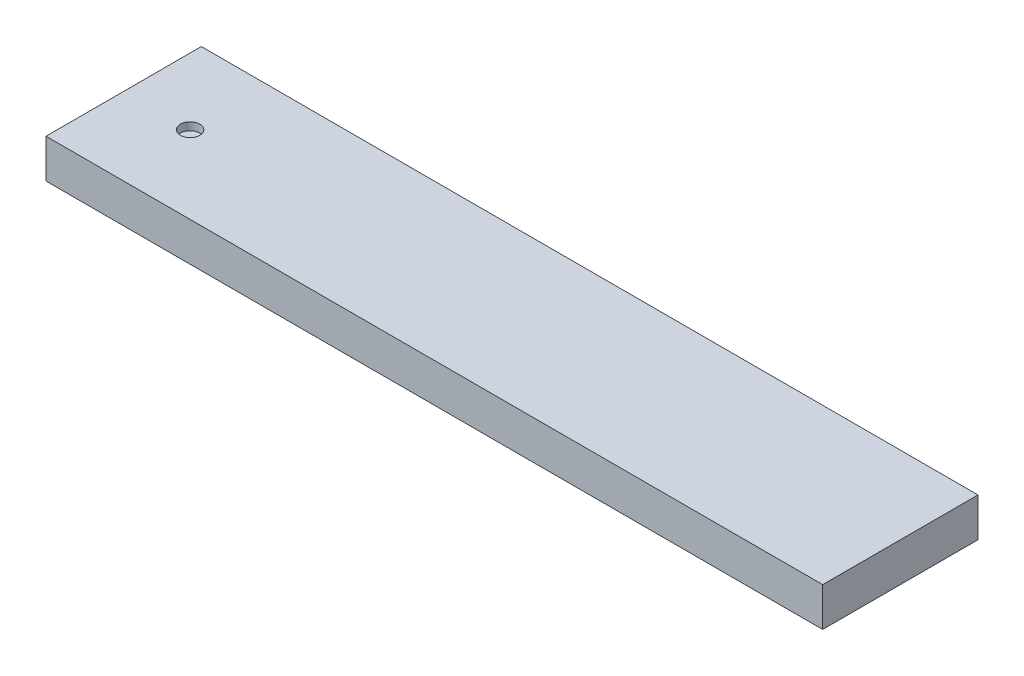
ISO-10303-21;
HEADER;
FILE_DESCRIPTION(('STEP AP214'),'2;1');
FILE_NAME('part.step','',(''),(''),'','','');
FILE_SCHEMA(('AUTOMOTIVE_DESIGN { 1 0 10303 214 1 1 1 1 }'));
ENDSEC;
DATA;
#1=APPLICATION_CONTEXT('core data for automotive mechanical design processes');
#2=APPLICATION_PROTOCOL_DEFINITION('international standard','automotive_design',2000,#1);
#3=PRODUCT_CONTEXT('',#1,'mechanical');
#4=PRODUCT('Part','Part','',(#3));
#5=PRODUCT_RELATED_PRODUCT_CATEGORY('part','',(#4));
#6=PRODUCT_DEFINITION_FORMATION('','',#4);
#7=PRODUCT_DEFINITION_CONTEXT('part definition',#1,'design');
#8=PRODUCT_DEFINITION('design','',#6,#7);
#9=PRODUCT_DEFINITION_SHAPE('','',#8);
#10=(LENGTH_UNIT() NAMED_UNIT(*) SI_UNIT(.MILLI.,.METRE.));
#11=(NAMED_UNIT(*) PLANE_ANGLE_UNIT() SI_UNIT($,.RADIAN.));
#12=(NAMED_UNIT(*) SI_UNIT($,.STERADIAN.) SOLID_ANGLE_UNIT());
#13=UNCERTAINTY_MEASURE_WITH_UNIT(LENGTH_MEASURE(1.E-05),#10,'distance_accuracy_value','');
#14=(GEOMETRIC_REPRESENTATION_CONTEXT(3) GLOBAL_UNCERTAINTY_ASSIGNED_CONTEXT((#13)) GLOBAL_UNIT_ASSIGNED_CONTEXT((#10,
#11,#12)) REPRESENTATION_CONTEXT('',''));
#15=CARTESIAN_POINT('',(0.,0.,0.));
#16=DIRECTION('',(0.,0.,1.));
#17=DIRECTION('',(1.,0.,0.));
#18=AXIS2_PLACEMENT_3D('',#15,#16,#17);
#19=CARTESIAN_POINT('',(127.,12.7,25.4));
#20=DIRECTION('',(-1.,0.,0.));
#21=DIRECTION('',(0.,0.,1.));
#22=AXIS2_PLACEMENT_3D('',#19,#20,#21);
#23=PLANE('',#22);
#24=DIRECTION('',(0.,0.,-1.));
#25=VECTOR('',#24,1.);
#26=CARTESIAN_POINT('',(127.,0.,25.4));
#27=LINE('',#26,#25);
#28=CARTESIAN_POINT('',(127.,0.,25.4));
#29=VERTEX_POINT('',#28);
#30=CARTESIAN_POINT('',(127.,0.,-25.4));
#31=VERTEX_POINT('',#30);
#32=EDGE_CURVE('E97',#29,#31,#27,.T.);
#33=ORIENTED_EDGE('',*,*,#32,.T.);
#34=DIRECTION('',(0.,-1.,0.));
#35=VECTOR('',#34,1.);
#36=CARTESIAN_POINT('',(127.,12.7,-25.4));
#37=LINE('',#36,#35);
#38=CARTESIAN_POINT('',(127.,12.7,-25.4));
#39=VERTEX_POINT('',#38);
#40=EDGE_CURVE('E11',#39,#31,#37,.T.);
#41=ORIENTED_EDGE('',*,*,#40,.F.);
#42=DIRECTION('',(0.,0.,-1.));
#43=VECTOR('',#42,1.);
#44=CARTESIAN_POINT('',(127.,12.7,25.4));
#45=LINE('',#44,#43);
#46=CARTESIAN_POINT('',(127.,12.7,25.4));
#47=VERTEX_POINT('',#46);
#48=EDGE_CURVE('E85',#47,#39,#45,.T.);
#49=ORIENTED_EDGE('',*,*,#48,.F.);
#50=DIRECTION('',(0.,-1.,0.));
#51=VECTOR('',#50,1.);
#52=CARTESIAN_POINT('',(127.,12.7,25.4));
#53=LINE('',#52,#51);
#54=EDGE_CURVE('E93',#47,#29,#53,.T.);
#55=ORIENTED_EDGE('',*,*,#54,.T.);
#56=EDGE_LOOP('',(#33,#41,#49,#55));
#57=FACE_BOUND('',#56,.T.);
#58=ADVANCED_FACE('F34',(#57),#23,.F.);
#59=CARTESIAN_POINT('',(-127.,12.7,-25.4));
#60=DIRECTION('',(0.,0.,1.));
#61=DIRECTION('',(1.,0.,0.));
#62=AXIS2_PLACEMENT_3D('',#59,#60,#61);
#63=PLANE('',#62);
#64=DIRECTION('',(-1.,0.,0.));
#65=VECTOR('',#64,1.);
#66=CARTESIAN_POINT('',(-127.,0.,-25.4));
#67=LINE('',#66,#65);
#68=CARTESIAN_POINT('',(-127.,0.,-25.4));
#69=VERTEX_POINT('',#68);
#70=EDGE_CURVE('E89',#31,#69,#67,.T.);
#71=ORIENTED_EDGE('',*,*,#70,.T.);
#72=DIRECTION('',(0.,-1.,0.));
#73=VECTOR('',#72,1.);
#74=CARTESIAN_POINT('',(-127.,12.7,-25.4));
#75=LINE('',#74,#73);
#76=CARTESIAN_POINT('',(-127.,12.7,-25.4));
#77=VERTEX_POINT('',#76);
#78=EDGE_CURVE('E42',#77,#69,#75,.T.);
#79=ORIENTED_EDGE('',*,*,#78,.F.);
#80=DIRECTION('',(-1.,0.,0.));
#81=VECTOR('',#80,1.);
#82=CARTESIAN_POINT('',(-127.,12.7,-25.4));
#83=LINE('',#82,#81);
#84=EDGE_CURVE('E80',#39,#77,#83,.T.);
#85=ORIENTED_EDGE('',*,*,#84,.F.);
#86=ORIENTED_EDGE('',*,*,#40,.T.);
#87=EDGE_LOOP('',(#71,#79,#85,#86));
#88=FACE_BOUND('',#87,.T.);
#89=ADVANCED_FACE('F88',(#88),#63,.F.);
#90=CARTESIAN_POINT('',(-127.,12.7,25.4));
#91=DIRECTION('',(1.,0.,0.));
#92=DIRECTION('',(0.,0.,-1.));
#93=AXIS2_PLACEMENT_3D('',#90,#91,#92);
#94=PLANE('',#93);
#95=DIRECTION('',(0.,0.,1.));
#96=VECTOR('',#95,1.);
#97=CARTESIAN_POINT('',(-127.,0.,25.4));
#98=LINE('',#97,#96);
#99=CARTESIAN_POINT('',(-127.,0.,25.4));
#100=VERTEX_POINT('',#99);
#101=EDGE_CURVE('E67',#69,#100,#98,.T.);
#102=ORIENTED_EDGE('',*,*,#101,.T.);
#103=DIRECTION('',(0.,-1.,0.));
#104=VECTOR('',#103,1.);
#105=CARTESIAN_POINT('',(-127.,12.7,25.4));
#106=LINE('',#105,#104);
#107=CARTESIAN_POINT('',(-127.,12.7,25.4));
#108=VERTEX_POINT('',#107);
#109=EDGE_CURVE('E90',#108,#100,#106,.T.);
#110=ORIENTED_EDGE('',*,*,#109,.F.);
#111=DIRECTION('',(0.,0.,1.));
#112=VECTOR('',#111,1.);
#113=CARTESIAN_POINT('',(-127.,12.7,25.4));
#114=LINE('',#113,#112);
#115=EDGE_CURVE('E83',#77,#108,#114,.T.);
#116=ORIENTED_EDGE('',*,*,#115,.F.);
#117=ORIENTED_EDGE('',*,*,#78,.T.);
#118=EDGE_LOOP('',(#102,#110,#116,#117));
#119=FACE_BOUND('',#118,.T.);
#120=ADVANCED_FACE('F91',(#119),#94,.F.);
#121=CARTESIAN_POINT('',(-127.,12.7,25.4));
#122=DIRECTION('',(0.,0.,-1.));
#123=DIRECTION('',(-1.,0.,0.));
#124=AXIS2_PLACEMENT_3D('',#121,#122,#123);
#125=PLANE('',#124);
#126=DIRECTION('',(1.,0.,0.));
#127=VECTOR('',#126,1.);
#128=CARTESIAN_POINT('',(-127.,0.,25.4));
#129=LINE('',#128,#127);
#130=EDGE_CURVE('E73',#100,#29,#129,.T.);
#131=ORIENTED_EDGE('',*,*,#130,.T.);
#132=ORIENTED_EDGE('',*,*,#54,.F.);
#133=DIRECTION('',(1.,0.,0.));
#134=VECTOR('',#133,1.);
#135=CARTESIAN_POINT('',(-127.,12.7,25.4));
#136=LINE('',#135,#134);
#137=EDGE_CURVE('E50',#108,#47,#136,.T.);
#138=ORIENTED_EDGE('',*,*,#137,.F.);
#139=ORIENTED_EDGE('',*,*,#109,.T.);
#140=EDGE_LOOP('',(#131,#132,#138,#139));
#141=FACE_BOUND('',#140,.T.);
#142=ADVANCED_FACE('F105',(#141),#125,.F.);
#143=CARTESIAN_POINT('',(0.,12.7,0.));
#144=DIRECTION('',(0.,-1.,0.));
#145=DIRECTION('',(0.,0.,-1.));
#146=AXIS2_PLACEMENT_3D('',#143,#144,#145);
#147=PLANE('',#146);
#148=CARTESIAN_POINT('',(-105.270556828017,12.7,0.));
#149=DIRECTION('',(0.,1.,0.));
#150=DIRECTION('',(0.,0.,1.));
#151=AXIS2_PLACEMENT_3D('',#148,#149,#150);
#152=CIRCLE('',#151,3.175);
#153=CARTESIAN_POINT('',(-105.270556828017,12.7,3.175));
#154=VERTEX_POINT('',#153);
#155=EDGE_CURVE('E111',#154,#154,#152,.T.);
#156=ORIENTED_EDGE('',*,*,#155,.F.);
#157=EDGE_LOOP('',(#156));
#158=FACE_BOUND('',#157,.T.);
#159=ORIENTED_EDGE('',*,*,#48,.T.);
#160=ORIENTED_EDGE('',*,*,#84,.T.);
#161=ORIENTED_EDGE('',*,*,#115,.T.);
#162=ORIENTED_EDGE('',*,*,#137,.T.);
#163=EDGE_LOOP('',(#159,#160,#161,#162));
#164=FACE_BOUND('',#163,.T.);
#165=ADVANCED_FACE('F81',(#158,#164),#147,.F.);
#166=CARTESIAN_POINT('',(0.,0.,0.));
#167=DIRECTION('',(0.,-1.,0.));
#168=DIRECTION('',(0.,0.,-1.));
#169=AXIS2_PLACEMENT_3D('',#166,#167,#168);
#170=PLANE('',#169);
#171=ORIENTED_EDGE('',*,*,#32,.F.);
#172=ORIENTED_EDGE('',*,*,#130,.F.);
#173=ORIENTED_EDGE('',*,*,#101,.F.);
#174=ORIENTED_EDGE('',*,*,#70,.F.);
#175=EDGE_LOOP('',(#171,#172,#173,#174));
#176=FACE_BOUND('',#175,.T.);
#177=ADVANCED_FACE('F108',(#176),#170,.T.);
#178=CARTESIAN_POINT('',(-105.270556828017,10.16,0.));
#179=DIRECTION('',(0.,1.,0.));
#180=DIRECTION('',(0.,0.,1.));
#181=AXIS2_PLACEMENT_3D('',#178,#179,#180);
#182=CYLINDRICAL_SURFACE('',#181,3.175);
#183=CARTESIAN_POINT('',(-105.270556828017,10.16,0.));
#184=DIRECTION('',(0.,1.,0.));
#185=DIRECTION('',(0.,0.,1.));
#186=AXIS2_PLACEMENT_3D('',#183,#184,#185);
#187=CIRCLE('',#186,3.175);
#188=CARTESIAN_POINT('',(-105.270556828017,10.16,3.175));
#189=VERTEX_POINT('',#188);
#190=EDGE_CURVE('E100',#189,#189,#187,.T.);
#191=ORIENTED_EDGE('',*,*,#190,.F.);
#192=EDGE_LOOP('',(#191));
#193=FACE_BOUND('',#192,.T.);
#194=ORIENTED_EDGE('',*,*,#155,.T.);
#195=EDGE_LOOP('',(#194));
#196=FACE_BOUND('',#195,.T.);
#197=ADVANCED_FACE('F119',(#193,#196),#182,.F.);
#198=CARTESIAN_POINT('',(-105.270556828017,10.16,0.));
#199=DIRECTION('',(0.,1.,0.));
#200=DIRECTION('',(0.,0.,1.));
#201=AXIS2_PLACEMENT_3D('',#198,#199,#200);
#202=PLANE('',#201);
#203=ORIENTED_EDGE('',*,*,#190,.T.);
#204=EDGE_LOOP('',(#203));
#205=FACE_BOUND('',#204,.T.);
#206=ADVANCED_FACE('F117',(#205),#202,.T.);
#207=CLOSED_SHELL('',(#58,#89,#120,#142,#165,#177,#197,#206));
#208=MANIFOLD_SOLID_BREP('B2',#207);
#209=ADVANCED_BREP_SHAPE_REPRESENTATION('',(#18,#208),#14);
#210=SHAPE_DEFINITION_REPRESENTATION(#9,#209);
ENDSEC;
END-ISO-10303-21;
